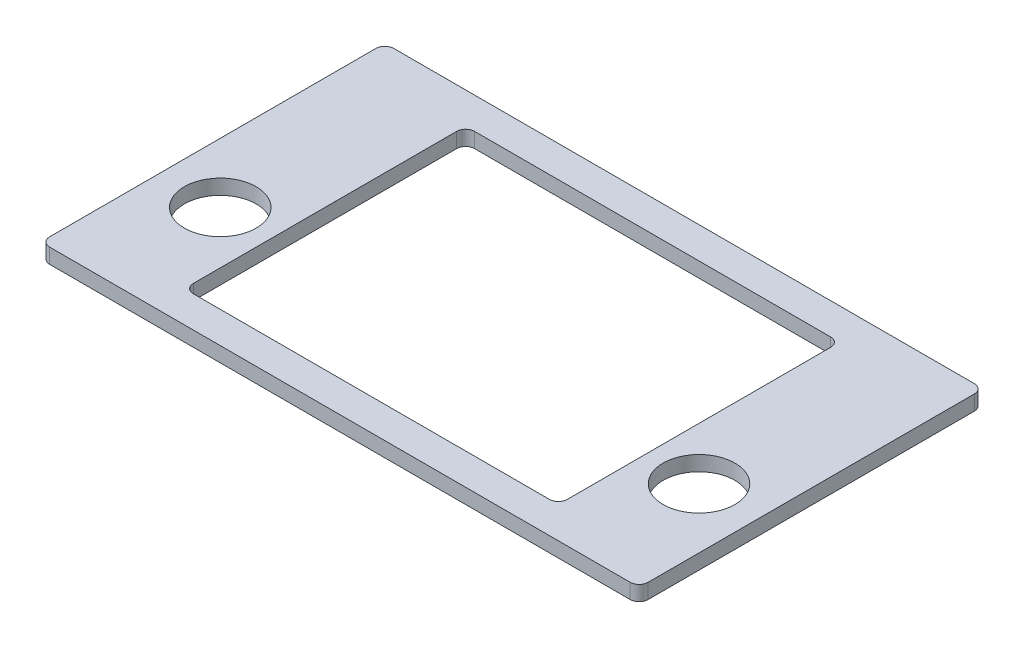
ISO-10303-21;
HEADER;
FILE_DESCRIPTION(('STEP AP214'),'2;1');
FILE_NAME('part.step','',(''),(''),'','','');
FILE_SCHEMA(('AUTOMOTIVE_DESIGN { 1 0 10303 214 1 1 1 1 }'));
ENDSEC;
DATA;
#1=APPLICATION_CONTEXT('core data for automotive mechanical design processes');
#2=APPLICATION_PROTOCOL_DEFINITION('international standard','automotive_design',2000,#1);
#3=PRODUCT_CONTEXT('',#1,'mechanical');
#4=PRODUCT('Part','Part','',(#3));
#5=PRODUCT_RELATED_PRODUCT_CATEGORY('part','',(#4));
#6=PRODUCT_DEFINITION_FORMATION('','',#4);
#7=PRODUCT_DEFINITION_CONTEXT('part definition',#1,'design');
#8=PRODUCT_DEFINITION('design','',#6,#7);
#9=PRODUCT_DEFINITION_SHAPE('','',#8);
#10=(LENGTH_UNIT() NAMED_UNIT(*) SI_UNIT(.MILLI.,.METRE.));
#11=(NAMED_UNIT(*) PLANE_ANGLE_UNIT() SI_UNIT($,.RADIAN.));
#12=(NAMED_UNIT(*) SI_UNIT($,.STERADIAN.) SOLID_ANGLE_UNIT());
#13=UNCERTAINTY_MEASURE_WITH_UNIT(LENGTH_MEASURE(1.E-05),#10,'distance_accuracy_value','');
#14=(GEOMETRIC_REPRESENTATION_CONTEXT(3) GLOBAL_UNCERTAINTY_ASSIGNED_CONTEXT((#13)) GLOBAL_UNIT_ASSIGNED_CONTEXT((#10,
#11,#12)) REPRESENTATION_CONTEXT('',''));
#15=CARTESIAN_POINT('',(0.,0.,0.));
#16=DIRECTION('',(0.,0.,1.));
#17=DIRECTION('',(1.,0.,0.));
#18=AXIS2_PLACEMENT_3D('',#15,#16,#17);
#19=CARTESIAN_POINT('',(250.19,6.35,-3.81));
#20=DIRECTION('',(0.,1.,0.));
#21=DIRECTION('',(0.,0.,1.));
#22=AXIS2_PLACEMENT_3D('',#19,#20,#21);
#23=PLANE('',#22);
#24=CARTESIAN_POINT('',(25.4,6.35,-50.8));
#25=DIRECTION('',(0.,1.,0.));
#26=DIRECTION('',(0.,0.,1.));
#27=AXIS2_PLACEMENT_3D('',#24,#25,#26);
#28=CIRCLE('',#27,15.24);
#29=CARTESIAN_POINT('',(25.4,6.35,-35.56));
#30=VERTEX_POINT('',#29);
#31=EDGE_CURVE('E373',#30,#30,#28,.T.);
#32=ORIENTED_EDGE('',*,*,#31,.F.);
#33=EDGE_LOOP('',(#32));
#34=FACE_BOUND('',#33,.T.);
#35=CARTESIAN_POINT('',(228.6,6.35,-50.8));
#36=DIRECTION('',(0.,1.,0.));
#37=DIRECTION('',(0.,0.,1.));
#38=AXIS2_PLACEMENT_3D('',#35,#36,#37);
#39=CIRCLE('',#38,15.24);
#40=CARTESIAN_POINT('',(228.6,6.35,-35.56));
#41=VERTEX_POINT('',#40);
#42=EDGE_CURVE('E378',#41,#41,#39,.T.);
#43=ORIENTED_EDGE('',*,*,#42,.F.);
#44=EDGE_LOOP('',(#43));
#45=FACE_BOUND('',#44,.T.);
#46=CARTESIAN_POINT('',(250.19,6.35,-3.81));
#47=DIRECTION('',(0.,1.,0.));
#48=DIRECTION('',(0.,0.,1.));
#49=AXIS2_PLACEMENT_3D('',#46,#47,#48);
#50=CIRCLE('',#49,3.80999999999999);
#51=CARTESIAN_POINT('',(250.19,6.35,0.));
#52=VERTEX_POINT('',#51);
#53=CARTESIAN_POINT('',(254.,6.35,-3.81));
#54=VERTEX_POINT('',#53);
#55=EDGE_CURVE('E214',#52,#54,#50,.T.);
#56=ORIENTED_EDGE('',*,*,#55,.T.);
#57=DIRECTION('',(0.,0.,-1.));
#58=VECTOR('',#57,1.);
#59=CARTESIAN_POINT('',(254.,6.35,-3.81));
#60=LINE('',#59,#58);
#61=CARTESIAN_POINT('',(254.,6.35,-142.24));
#62=VERTEX_POINT('',#61);
#63=EDGE_CURVE('E217',#54,#62,#60,.T.);
#64=ORIENTED_EDGE('',*,*,#63,.T.);
#65=CARTESIAN_POINT('',(250.19,6.35,-142.24));
#66=DIRECTION('',(0.,1.,0.));
#67=DIRECTION('',(0.,0.,-1.));
#68=AXIS2_PLACEMENT_3D('',#65,#66,#67);
#69=CIRCLE('',#68,3.81000000000002);
#70=CARTESIAN_POINT('',(250.19,6.35,-146.05));
#71=VERTEX_POINT('',#70);
#72=EDGE_CURVE('E220',#62,#71,#69,.T.);
#73=ORIENTED_EDGE('',*,*,#72,.T.);
#74=DIRECTION('',(-1.,0.,0.));
#75=VECTOR('',#74,1.);
#76=CARTESIAN_POINT('',(3.81,6.35,-146.05));
#77=LINE('',#76,#75);
#78=CARTESIAN_POINT('',(3.81,6.35,-146.05));
#79=VERTEX_POINT('',#78);
#80=EDGE_CURVE('E222',#71,#79,#77,.T.);
#81=ORIENTED_EDGE('',*,*,#80,.T.);
#82=CARTESIAN_POINT('',(3.81,6.35,-142.24));
#83=DIRECTION('',(0.,1.,0.));
#84=DIRECTION('',(0.,0.,-1.));
#85=AXIS2_PLACEMENT_3D('',#82,#83,#84);
#86=CIRCLE('',#85,3.81);
#87=CARTESIAN_POINT('',(0.,6.35,-142.24));
#88=VERTEX_POINT('',#87);
#89=EDGE_CURVE('E224',#79,#88,#86,.T.);
#90=ORIENTED_EDGE('',*,*,#89,.T.);
#91=DIRECTION('',(0.,0.,1.));
#92=VECTOR('',#91,1.);
#93=CARTESIAN_POINT('',(0.,6.35,-3.81000000000003));
#94=LINE('',#93,#92);
#95=CARTESIAN_POINT('',(0.,6.35,-3.81000000000003));
#96=VERTEX_POINT('',#95);
#97=EDGE_CURVE('E226',#88,#96,#94,.T.);
#98=ORIENTED_EDGE('',*,*,#97,.T.);
#99=CARTESIAN_POINT('',(3.81,6.35,-3.81));
#100=DIRECTION('',(0.,1.,0.));
#101=DIRECTION('',(0.,0.,-1.));
#102=AXIS2_PLACEMENT_3D('',#99,#100,#101);
#103=CIRCLE('',#102,3.81);
#104=CARTESIAN_POINT('',(3.81000000000003,6.35,0.));
#105=VERTEX_POINT('',#104);
#106=EDGE_CURVE('E228',#96,#105,#103,.T.);
#107=ORIENTED_EDGE('',*,*,#106,.T.);
#108=DIRECTION('',(1.,0.,0.));
#109=VECTOR('',#108,1.);
#110=CARTESIAN_POINT('',(3.81000000000003,6.35,0.));
#111=LINE('',#110,#109);
#112=EDGE_CURVE('E230',#105,#52,#111,.T.);
#113=ORIENTED_EDGE('',*,*,#112,.T.);
#114=EDGE_LOOP('',(#56,#64,#73,#81,#90,#98,#107,#113));
#115=FACE_BOUND('',#114,.T.);
#116=DIRECTION('',(1.,0.,0.));
#117=VECTOR('',#116,1.);
#118=CARTESIAN_POINT('',(51.435,6.35,-13.335));
#119=LINE('',#118,#117);
#120=CARTESIAN_POINT('',(51.435,6.35,-13.335));
#121=VERTEX_POINT('',#120);
#122=CARTESIAN_POINT('',(202.565,6.35,-13.335));
#123=VERTEX_POINT('',#122);
#124=EDGE_CURVE('E155',#121,#123,#119,.T.);
#125=ORIENTED_EDGE('',*,*,#124,.F.);
#126=CARTESIAN_POINT('',(51.435,6.35,-17.145));
#127=DIRECTION('',(0.,1.,0.));
#128=DIRECTION('',(0.,0.,1.));
#129=AXIS2_PLACEMENT_3D('',#126,#127,#128);
#130=CIRCLE('',#129,3.81);
#131=CARTESIAN_POINT('',(47.625,6.35,-17.145));
#132=VERTEX_POINT('',#131);
#133=EDGE_CURVE('E147',#132,#121,#130,.T.);
#134=ORIENTED_EDGE('',*,*,#133,.F.);
#135=DIRECTION('',(0.,0.,1.));
#136=VECTOR('',#135,1.);
#137=CARTESIAN_POINT('',(47.625,6.35,-128.905));
#138=LINE('',#137,#136);
#139=CARTESIAN_POINT('',(47.625,6.35,-128.905));
#140=VERTEX_POINT('',#139);
#141=EDGE_CURVE('E181',#140,#132,#138,.T.);
#142=ORIENTED_EDGE('',*,*,#141,.F.);
#143=CARTESIAN_POINT('',(51.435,6.35,-128.905));
#144=DIRECTION('',(0.,1.,0.));
#145=DIRECTION('',(0.,0.,1.));
#146=AXIS2_PLACEMENT_3D('',#143,#144,#145);
#147=CIRCLE('',#146,3.81);
#148=CARTESIAN_POINT('',(51.435,6.35,-132.715));
#149=VERTEX_POINT('',#148);
#150=EDGE_CURVE('E179',#149,#140,#147,.T.);
#151=ORIENTED_EDGE('',*,*,#150,.F.);
#152=DIRECTION('',(-1.,0.,0.));
#153=VECTOR('',#152,1.);
#154=CARTESIAN_POINT('',(51.435,6.35,-132.715));
#155=LINE('',#154,#153);
#156=CARTESIAN_POINT('',(202.565,6.35,-132.715));
#157=VERTEX_POINT('',#156);
#158=EDGE_CURVE('E177',#157,#149,#155,.T.);
#159=ORIENTED_EDGE('',*,*,#158,.F.);
#160=CARTESIAN_POINT('',(202.565,6.35,-128.905));
#161=DIRECTION('',(0.,1.,0.));
#162=DIRECTION('',(0.,0.,-1.));
#163=AXIS2_PLACEMENT_3D('',#160,#161,#162);
#164=CIRCLE('',#163,3.81000000000001);
#165=CARTESIAN_POINT('',(206.375,6.35,-128.905));
#166=VERTEX_POINT('',#165);
#167=EDGE_CURVE('E175',#166,#157,#164,.T.);
#168=ORIENTED_EDGE('',*,*,#167,.F.);
#169=DIRECTION('',(0.,0.,-1.));
#170=VECTOR('',#169,1.);
#171=CARTESIAN_POINT('',(206.375,6.35,-128.905));
#172=LINE('',#171,#170);
#173=CARTESIAN_POINT('',(206.375,6.35,-17.145));
#174=VERTEX_POINT('',#173);
#175=EDGE_CURVE('E170',#174,#166,#172,.T.);
#176=ORIENTED_EDGE('',*,*,#175,.F.);
#177=CARTESIAN_POINT('',(202.565,6.35,-17.145));
#178=DIRECTION('',(0.,1.,0.));
#179=DIRECTION('',(0.,0.,1.));
#180=AXIS2_PLACEMENT_3D('',#177,#178,#179);
#181=CIRCLE('',#180,3.80999999999998);
#182=EDGE_CURVE('E168',#123,#174,#181,.T.);
#183=ORIENTED_EDGE('',*,*,#182,.F.);
#184=EDGE_LOOP('',(#125,#134,#142,#151,#159,#168,#176,#183));
#185=FACE_BOUND('',#184,.T.);
#186=ADVANCED_FACE('F34',(#34,#45,#115,#185),#23,.T.);
#187=CARTESIAN_POINT('',(250.19,0.,-3.81));
#188=DIRECTION('',(0.,1.,0.));
#189=DIRECTION('',(0.,0.,1.));
#190=AXIS2_PLACEMENT_3D('',#187,#188,#189);
#191=PLANE('',#190);
#192=CARTESIAN_POINT('',(25.4,0.,-50.8));
#193=DIRECTION('',(0.,1.,0.));
#194=DIRECTION('',(0.,0.,1.));
#195=AXIS2_PLACEMENT_3D('',#192,#193,#194);
#196=CIRCLE('',#195,15.24);
#197=CARTESIAN_POINT('',(25.4,0.,-35.56));
#198=VERTEX_POINT('',#197);
#199=EDGE_CURVE('E184',#198,#198,#196,.T.);
#200=ORIENTED_EDGE('',*,*,#199,.T.);
#201=EDGE_LOOP('',(#200));
#202=FACE_BOUND('',#201,.T.);
#203=CARTESIAN_POINT('',(228.6,0.,-50.8));
#204=DIRECTION('',(0.,1.,0.));
#205=DIRECTION('',(0.,0.,1.));
#206=AXIS2_PLACEMENT_3D('',#203,#204,#205);
#207=CIRCLE('',#206,15.24);
#208=CARTESIAN_POINT('',(228.6,0.,-35.56));
#209=VERTEX_POINT('',#208);
#210=EDGE_CURVE('E374',#209,#209,#207,.T.);
#211=ORIENTED_EDGE('',*,*,#210,.T.);
#212=EDGE_LOOP('',(#211));
#213=FACE_BOUND('',#212,.T.);
#214=CARTESIAN_POINT('',(250.19,0.,-3.81));
#215=DIRECTION('',(0.,1.,0.));
#216=DIRECTION('',(0.,0.,1.));
#217=AXIS2_PLACEMENT_3D('',#214,#215,#216);
#218=CIRCLE('',#217,3.80999999999999);
#219=CARTESIAN_POINT('',(250.19,0.,0.));
#220=VERTEX_POINT('',#219);
#221=CARTESIAN_POINT('',(254.,0.,-3.81));
#222=VERTEX_POINT('',#221);
#223=EDGE_CURVE('E163',#220,#222,#218,.T.);
#224=ORIENTED_EDGE('',*,*,#223,.F.);
#225=DIRECTION('',(1.,0.,0.));
#226=VECTOR('',#225,1.);
#227=CARTESIAN_POINT('',(3.81000000000003,0.,0.));
#228=LINE('',#227,#226);
#229=CARTESIAN_POINT('',(3.81000000000003,0.,0.));
#230=VERTEX_POINT('',#229);
#231=EDGE_CURVE('E218',#230,#220,#228,.T.);
#232=ORIENTED_EDGE('',*,*,#231,.F.);
#233=CARTESIAN_POINT('',(3.81,0.,-3.81));
#234=DIRECTION('',(0.,1.,0.));
#235=DIRECTION('',(0.,0.,-1.));
#236=AXIS2_PLACEMENT_3D('',#233,#234,#235);
#237=CIRCLE('',#236,3.81);
#238=CARTESIAN_POINT('',(0.,0.,-3.81000000000003));
#239=VERTEX_POINT('',#238);
#240=EDGE_CURVE('E245',#239,#230,#237,.T.);
#241=ORIENTED_EDGE('',*,*,#240,.F.);
#242=DIRECTION('',(0.,0.,1.));
#243=VECTOR('',#242,1.);
#244=CARTESIAN_POINT('',(0.,0.,-3.81000000000003));
#245=LINE('',#244,#243);
#246=CARTESIAN_POINT('',(0.,0.,-142.24));
#247=VERTEX_POINT('',#246);
#248=EDGE_CURVE('E243',#247,#239,#245,.T.);
#249=ORIENTED_EDGE('',*,*,#248,.F.);
#250=CARTESIAN_POINT('',(3.81,0.,-142.24));
#251=DIRECTION('',(0.,1.,0.));
#252=DIRECTION('',(0.,0.,-1.));
#253=AXIS2_PLACEMENT_3D('',#250,#251,#252);
#254=CIRCLE('',#253,3.81);
#255=CARTESIAN_POINT('',(3.81,0.,-146.05));
#256=VERTEX_POINT('',#255);
#257=EDGE_CURVE('E241',#256,#247,#254,.T.);
#258=ORIENTED_EDGE('',*,*,#257,.F.);
#259=DIRECTION('',(-1.,0.,0.));
#260=VECTOR('',#259,1.);
#261=CARTESIAN_POINT('',(3.81,0.,-146.05));
#262=LINE('',#261,#260);
#263=CARTESIAN_POINT('',(250.19,0.,-146.05));
#264=VERTEX_POINT('',#263);
#265=EDGE_CURVE('E239',#264,#256,#262,.T.);
#266=ORIENTED_EDGE('',*,*,#265,.F.);
#267=CARTESIAN_POINT('',(250.19,0.,-142.24));
#268=DIRECTION('',(0.,1.,0.));
#269=DIRECTION('',(0.,0.,-1.));
#270=AXIS2_PLACEMENT_3D('',#267,#268,#269);
#271=CIRCLE('',#270,3.81000000000002);
#272=CARTESIAN_POINT('',(254.,0.,-142.24));
#273=VERTEX_POINT('',#272);
#274=EDGE_CURVE('E237',#273,#264,#271,.T.);
#275=ORIENTED_EDGE('',*,*,#274,.F.);
#276=DIRECTION('',(0.,0.,-1.));
#277=VECTOR('',#276,1.);
#278=CARTESIAN_POINT('',(254.,0.,-3.81));
#279=LINE('',#278,#277);
#280=EDGE_CURVE('E235',#222,#273,#279,.T.);
#281=ORIENTED_EDGE('',*,*,#280,.F.);
#282=EDGE_LOOP('',(#224,#232,#241,#249,#258,#266,#275,#281));
#283=FACE_BOUND('',#282,.T.);
#284=CARTESIAN_POINT('',(51.435,0.,-17.145));
#285=DIRECTION('',(0.,1.,0.));
#286=DIRECTION('',(0.,0.,1.));
#287=AXIS2_PLACEMENT_3D('',#284,#285,#286);
#288=CIRCLE('',#287,3.81);
#289=CARTESIAN_POINT('',(47.6250000000001,0.,-17.145));
#290=VERTEX_POINT('',#289);
#291=CARTESIAN_POINT('',(51.435,0.,-13.335));
#292=VERTEX_POINT('',#291);
#293=EDGE_CURVE('E57',#290,#292,#288,.T.);
#294=ORIENTED_EDGE('',*,*,#293,.T.);
#295=DIRECTION('',(1.,0.,0.));
#296=VECTOR('',#295,1.);
#297=CARTESIAN_POINT('',(51.435,0.,-13.335));
#298=LINE('',#297,#296);
#299=CARTESIAN_POINT('',(202.565,0.,-13.335));
#300=VERTEX_POINT('',#299);
#301=EDGE_CURVE('E162',#292,#300,#298,.T.);
#302=ORIENTED_EDGE('',*,*,#301,.T.);
#303=CARTESIAN_POINT('',(202.565,0.,-17.145));
#304=DIRECTION('',(0.,1.,0.));
#305=DIRECTION('',(0.,0.,1.));
#306=AXIS2_PLACEMENT_3D('',#303,#304,#305);
#307=CIRCLE('',#306,3.80999999999998);
#308=CARTESIAN_POINT('',(206.375,0.,-17.145));
#309=VERTEX_POINT('',#308);
#310=EDGE_CURVE('E186',#300,#309,#307,.T.);
#311=ORIENTED_EDGE('',*,*,#310,.T.);
#312=DIRECTION('',(0.,0.,-1.));
#313=VECTOR('',#312,1.);
#314=CARTESIAN_POINT('',(206.375,0.,-128.905));
#315=LINE('',#314,#313);
#316=CARTESIAN_POINT('',(206.375,0.,-128.905));
#317=VERTEX_POINT('',#316);
#318=EDGE_CURVE('E189',#309,#317,#315,.T.);
#319=ORIENTED_EDGE('',*,*,#318,.T.);
#320=CARTESIAN_POINT('',(202.565,0.,-128.905));
#321=DIRECTION('',(0.,1.,0.));
#322=DIRECTION('',(0.,0.,-1.));
#323=AXIS2_PLACEMENT_3D('',#320,#321,#322);
#324=CIRCLE('',#323,3.81000000000001);
#325=CARTESIAN_POINT('',(202.565,0.,-132.715));
#326=VERTEX_POINT('',#325);
#327=EDGE_CURVE('E192',#317,#326,#324,.T.);
#328=ORIENTED_EDGE('',*,*,#327,.T.);
#329=DIRECTION('',(-1.,0.,0.));
#330=VECTOR('',#329,1.);
#331=CARTESIAN_POINT('',(51.435,0.,-132.715));
#332=LINE('',#331,#330);
#333=CARTESIAN_POINT('',(51.435,0.,-132.715));
#334=VERTEX_POINT('',#333);
#335=EDGE_CURVE('E195',#326,#334,#332,.T.);
#336=ORIENTED_EDGE('',*,*,#335,.T.);
#337=CARTESIAN_POINT('',(51.435,0.,-128.905));
#338=DIRECTION('',(0.,1.,0.));
#339=DIRECTION('',(0.,0.,1.));
#340=AXIS2_PLACEMENT_3D('',#337,#338,#339);
#341=CIRCLE('',#340,3.81);
#342=CARTESIAN_POINT('',(47.625,0.,-128.905));
#343=VERTEX_POINT('',#342);
#344=EDGE_CURVE('E198',#334,#343,#341,.T.);
#345=ORIENTED_EDGE('',*,*,#344,.T.);
#346=DIRECTION('',(0.,0.,1.));
#347=VECTOR('',#346,1.);
#348=CARTESIAN_POINT('',(47.625,0.,-128.905));
#349=LINE('',#348,#347);
#350=EDGE_CURVE('E156',#343,#290,#349,.T.);
#351=ORIENTED_EDGE('',*,*,#350,.T.);
#352=EDGE_LOOP('',(#294,#302,#311,#319,#328,#336,#345,#351));
#353=FACE_BOUND('',#352,.T.);
#354=ADVANCED_FACE('F275',(#202,#213,#283,#353),#191,.F.);
#355=CARTESIAN_POINT('',(250.19,6.35,-3.81));
#356=DIRECTION('',(0.,-1.,0.));
#357=DIRECTION('',(0.,0.,-1.));
#358=AXIS2_PLACEMENT_3D('',#355,#356,#357);
#359=CYLINDRICAL_SURFACE('',#358,3.80999999999999);
#360=ORIENTED_EDGE('',*,*,#223,.T.);
#361=DIRECTION('',(0.,-1.,0.));
#362=VECTOR('',#361,1.);
#363=CARTESIAN_POINT('',(254.,6.35,-3.81));
#364=LINE('',#363,#362);
#365=EDGE_CURVE('E11',#54,#222,#364,.T.);
#366=ORIENTED_EDGE('',*,*,#365,.F.);
#367=ORIENTED_EDGE('',*,*,#55,.F.);
#368=DIRECTION('',(0.,-1.,0.));
#369=VECTOR('',#368,1.);
#370=CARTESIAN_POINT('',(250.19,6.35,0.));
#371=LINE('',#370,#369);
#372=EDGE_CURVE('E232',#52,#220,#371,.T.);
#373=ORIENTED_EDGE('',*,*,#372,.T.);
#374=EDGE_LOOP('',(#360,#366,#367,#373));
#375=FACE_BOUND('',#374,.T.);
#376=ADVANCED_FACE('F36',(#375),#359,.T.);
#377=CARTESIAN_POINT('',(254.,6.35,-3.81));
#378=DIRECTION('',(-1.,0.,0.));
#379=DIRECTION('',(0.,0.,1.));
#380=AXIS2_PLACEMENT_3D('',#377,#378,#379);
#381=PLANE('',#380);
#382=ORIENTED_EDGE('',*,*,#280,.T.);
#383=DIRECTION('',(0.,-1.,0.));
#384=VECTOR('',#383,1.);
#385=CARTESIAN_POINT('',(254.,6.35,-142.24));
#386=LINE('',#385,#384);
#387=EDGE_CURVE('E42',#62,#273,#386,.T.);
#388=ORIENTED_EDGE('',*,*,#387,.F.);
#389=ORIENTED_EDGE('',*,*,#63,.F.);
#390=ORIENTED_EDGE('',*,*,#365,.T.);
#391=EDGE_LOOP('',(#382,#388,#389,#390));
#392=FACE_BOUND('',#391,.T.);
#393=ADVANCED_FACE('F292',(#392),#381,.F.);
#394=CARTESIAN_POINT('',(250.19,6.35,-142.24));
#395=DIRECTION('',(0.,-1.,0.));
#396=DIRECTION('',(0.,0.,-1.));
#397=AXIS2_PLACEMENT_3D('',#394,#395,#396);
#398=CYLINDRICAL_SURFACE('',#397,3.81000000000002);
#399=ORIENTED_EDGE('',*,*,#274,.T.);
#400=DIRECTION('',(0.,-1.,0.));
#401=VECTOR('',#400,1.);
#402=CARTESIAN_POINT('',(250.19,6.35,-146.05));
#403=LINE('',#402,#401);
#404=EDGE_CURVE('E262',#71,#264,#403,.T.);
#405=ORIENTED_EDGE('',*,*,#404,.F.);
#406=ORIENTED_EDGE('',*,*,#72,.F.);
#407=ORIENTED_EDGE('',*,*,#387,.T.);
#408=EDGE_LOOP('',(#399,#405,#406,#407));
#409=FACE_BOUND('',#408,.T.);
#410=ADVANCED_FACE('F269',(#409),#398,.T.);
#411=CARTESIAN_POINT('',(3.81,6.35,-146.05));
#412=DIRECTION('',(0.,0.,1.));
#413=DIRECTION('',(1.,0.,0.));
#414=AXIS2_PLACEMENT_3D('',#411,#412,#413);
#415=PLANE('',#414);
#416=ORIENTED_EDGE('',*,*,#265,.T.);
#417=DIRECTION('',(0.,-1.,0.));
#418=VECTOR('',#417,1.);
#419=CARTESIAN_POINT('',(3.81,6.35,-146.05));
#420=LINE('',#419,#418);
#421=EDGE_CURVE('E259',#79,#256,#420,.T.);
#422=ORIENTED_EDGE('',*,*,#421,.F.);
#423=ORIENTED_EDGE('',*,*,#80,.F.);
#424=ORIENTED_EDGE('',*,*,#404,.T.);
#425=EDGE_LOOP('',(#416,#422,#423,#424));
#426=FACE_BOUND('',#425,.T.);
#427=ADVANCED_FACE('F281',(#426),#415,.F.);
#428=CARTESIAN_POINT('',(3.81,6.35,-142.24));
#429=DIRECTION('',(0.,-1.,0.));
#430=DIRECTION('',(0.,0.,-1.));
#431=AXIS2_PLACEMENT_3D('',#428,#429,#430);
#432=CYLINDRICAL_SURFACE('',#431,3.81);
#433=ORIENTED_EDGE('',*,*,#257,.T.);
#434=DIRECTION('',(0.,-1.,0.));
#435=VECTOR('',#434,1.);
#436=CARTESIAN_POINT('',(0.,6.35,-142.24));
#437=LINE('',#436,#435);
#438=EDGE_CURVE('E256',#88,#247,#437,.T.);
#439=ORIENTED_EDGE('',*,*,#438,.F.);
#440=ORIENTED_EDGE('',*,*,#89,.F.);
#441=ORIENTED_EDGE('',*,*,#421,.T.);
#442=EDGE_LOOP('',(#433,#439,#440,#441));
#443=FACE_BOUND('',#442,.T.);
#444=ADVANCED_FACE('F285',(#443),#432,.T.);
#445=CARTESIAN_POINT('',(0.,6.35,-3.81000000000003));
#446=DIRECTION('',(1.,0.,0.));
#447=DIRECTION('',(0.,0.,-1.));
#448=AXIS2_PLACEMENT_3D('',#445,#446,#447);
#449=PLANE('',#448);
#450=ORIENTED_EDGE('',*,*,#248,.T.);
#451=DIRECTION('',(0.,-1.,0.));
#452=VECTOR('',#451,1.);
#453=CARTESIAN_POINT('',(0.,6.35,-3.81000000000003));
#454=LINE('',#453,#452);
#455=EDGE_CURVE('E253',#96,#239,#454,.T.);
#456=ORIENTED_EDGE('',*,*,#455,.F.);
#457=ORIENTED_EDGE('',*,*,#97,.F.);
#458=ORIENTED_EDGE('',*,*,#438,.T.);
#459=EDGE_LOOP('',(#450,#456,#457,#458));
#460=FACE_BOUND('',#459,.T.);
#461=ADVANCED_FACE('F305',(#460),#449,.F.);
#462=CARTESIAN_POINT('',(3.81,6.35,-3.81));
#463=DIRECTION('',(0.,-1.,0.));
#464=DIRECTION('',(0.,0.,-1.));
#465=AXIS2_PLACEMENT_3D('',#462,#463,#464);
#466=CYLINDRICAL_SURFACE('',#465,3.81);
#467=ORIENTED_EDGE('',*,*,#240,.T.);
#468=DIRECTION('',(0.,-1.,0.));
#469=VECTOR('',#468,1.);
#470=CARTESIAN_POINT('',(3.81000000000003,6.35,0.));
#471=LINE('',#470,#469);
#472=EDGE_CURVE('E250',#105,#230,#471,.T.);
#473=ORIENTED_EDGE('',*,*,#472,.F.);
#474=ORIENTED_EDGE('',*,*,#106,.F.);
#475=ORIENTED_EDGE('',*,*,#455,.T.);
#476=EDGE_LOOP('',(#467,#473,#474,#475));
#477=FACE_BOUND('',#476,.T.);
#478=ADVANCED_FACE('F303',(#477),#466,.T.);
#479=CARTESIAN_POINT('',(3.81000000000003,6.35,0.));
#480=DIRECTION('',(0.,0.,-1.));
#481=DIRECTION('',(-1.,0.,0.));
#482=AXIS2_PLACEMENT_3D('',#479,#480,#481);
#483=PLANE('',#482);
#484=ORIENTED_EDGE('',*,*,#231,.T.);
#485=ORIENTED_EDGE('',*,*,#372,.F.);
#486=ORIENTED_EDGE('',*,*,#112,.F.);
#487=ORIENTED_EDGE('',*,*,#472,.T.);
#488=EDGE_LOOP('',(#484,#485,#486,#487));
#489=FACE_BOUND('',#488,.T.);
#490=ADVANCED_FACE('F298',(#489),#483,.F.);
#491=CARTESIAN_POINT('',(51.435,6.35,-17.145));
#492=DIRECTION('',(0.,-1.,0.));
#493=DIRECTION('',(0.,0.,-1.));
#494=AXIS2_PLACEMENT_3D('',#491,#492,#493);
#495=CYLINDRICAL_SURFACE('',#494,3.81);
#496=ORIENTED_EDGE('',*,*,#293,.F.);
#497=DIRECTION('',(0.,-1.,0.));
#498=VECTOR('',#497,1.);
#499=CARTESIAN_POINT('',(47.625,6.35,-17.145));
#500=LINE('',#499,#498);
#501=EDGE_CURVE('E151',#132,#290,#500,.T.);
#502=ORIENTED_EDGE('',*,*,#501,.F.);
#503=ORIENTED_EDGE('',*,*,#133,.T.);
#504=DIRECTION('',(0.,-1.,0.));
#505=VECTOR('',#504,1.);
#506=CARTESIAN_POINT('',(51.435,6.35,-13.335));
#507=LINE('',#506,#505);
#508=EDGE_CURVE('E150',#121,#292,#507,.T.);
#509=ORIENTED_EDGE('',*,*,#508,.T.);
#510=EDGE_LOOP('',(#496,#502,#503,#509));
#511=FACE_BOUND('',#510,.T.);
#512=ADVANCED_FACE('F149',(#511),#495,.F.);
#513=CARTESIAN_POINT('',(51.435,6.35,-13.335));
#514=DIRECTION('',(0.,0.,-1.));
#515=DIRECTION('',(-1.,0.,0.));
#516=AXIS2_PLACEMENT_3D('',#513,#514,#515);
#517=PLANE('',#516);
#518=ORIENTED_EDGE('',*,*,#301,.F.);
#519=ORIENTED_EDGE('',*,*,#508,.F.);
#520=ORIENTED_EDGE('',*,*,#124,.T.);
#521=DIRECTION('',(0.,-1.,0.));
#522=VECTOR('',#521,1.);
#523=CARTESIAN_POINT('',(202.565,6.35,-13.335));
#524=LINE('',#523,#522);
#525=EDGE_CURVE('E164',#123,#300,#524,.T.);
#526=ORIENTED_EDGE('',*,*,#525,.T.);
#527=EDGE_LOOP('',(#518,#519,#520,#526));
#528=FACE_BOUND('',#527,.T.);
#529=ADVANCED_FACE('F159',(#528),#517,.T.);
#530=CARTESIAN_POINT('',(202.565,6.35,-17.145));
#531=DIRECTION('',(0.,-1.,0.));
#532=DIRECTION('',(0.,0.,-1.));
#533=AXIS2_PLACEMENT_3D('',#530,#531,#532);
#534=CYLINDRICAL_SURFACE('',#533,3.80999999999998);
#535=ORIENTED_EDGE('',*,*,#310,.F.);
#536=ORIENTED_EDGE('',*,*,#525,.F.);
#537=ORIENTED_EDGE('',*,*,#182,.T.);
#538=DIRECTION('',(0.,-1.,0.));
#539=VECTOR('',#538,1.);
#540=CARTESIAN_POINT('',(206.375,6.35,-17.145));
#541=LINE('',#540,#539);
#542=EDGE_CURVE('E211',#174,#309,#541,.T.);
#543=ORIENTED_EDGE('',*,*,#542,.T.);
#544=EDGE_LOOP('',(#535,#536,#537,#543));
#545=FACE_BOUND('',#544,.T.);
#546=ADVANCED_FACE('F334',(#545),#534,.F.);
#547=CARTESIAN_POINT('',(206.375,6.35,-128.905));
#548=DIRECTION('',(-1.,0.,0.));
#549=DIRECTION('',(0.,0.,1.));
#550=AXIS2_PLACEMENT_3D('',#547,#548,#549);
#551=PLANE('',#550);
#552=ORIENTED_EDGE('',*,*,#318,.F.);
#553=ORIENTED_EDGE('',*,*,#542,.F.);
#554=ORIENTED_EDGE('',*,*,#175,.T.);
#555=DIRECTION('',(0.,-1.,0.));
#556=VECTOR('',#555,1.);
#557=CARTESIAN_POINT('',(206.375,6.35,-128.905));
#558=LINE('',#557,#556);
#559=EDGE_CURVE('E209',#166,#317,#558,.T.);
#560=ORIENTED_EDGE('',*,*,#559,.T.);
#561=EDGE_LOOP('',(#552,#553,#554,#560));
#562=FACE_BOUND('',#561,.T.);
#563=ADVANCED_FACE('F338',(#562),#551,.T.);
#564=CARTESIAN_POINT('',(202.565,6.35,-128.905));
#565=DIRECTION('',(0.,-1.,0.));
#566=DIRECTION('',(0.,0.,-1.));
#567=AXIS2_PLACEMENT_3D('',#564,#565,#566);
#568=CYLINDRICAL_SURFACE('',#567,3.81000000000001);
#569=ORIENTED_EDGE('',*,*,#327,.F.);
#570=ORIENTED_EDGE('',*,*,#559,.F.);
#571=ORIENTED_EDGE('',*,*,#167,.T.);
#572=DIRECTION('',(0.,-1.,0.));
#573=VECTOR('',#572,1.);
#574=CARTESIAN_POINT('',(202.565,6.35,-132.715));
#575=LINE('',#574,#573);
#576=EDGE_CURVE('E207',#157,#326,#575,.T.);
#577=ORIENTED_EDGE('',*,*,#576,.T.);
#578=EDGE_LOOP('',(#569,#570,#571,#577));
#579=FACE_BOUND('',#578,.T.);
#580=ADVANCED_FACE('F344',(#579),#568,.F.);
#581=CARTESIAN_POINT('',(51.435,6.35,-132.715));
#582=DIRECTION('',(0.,0.,1.));
#583=DIRECTION('',(1.,0.,0.));
#584=AXIS2_PLACEMENT_3D('',#581,#582,#583);
#585=PLANE('',#584);
#586=ORIENTED_EDGE('',*,*,#335,.F.);
#587=ORIENTED_EDGE('',*,*,#576,.F.);
#588=ORIENTED_EDGE('',*,*,#158,.T.);
#589=DIRECTION('',(0.,-1.,0.));
#590=VECTOR('',#589,1.);
#591=CARTESIAN_POINT('',(51.435,6.35,-132.715));
#592=LINE('',#591,#590);
#593=EDGE_CURVE('E205',#149,#334,#592,.T.);
#594=ORIENTED_EDGE('',*,*,#593,.T.);
#595=EDGE_LOOP('',(#586,#587,#588,#594));
#596=FACE_BOUND('',#595,.T.);
#597=ADVANCED_FACE('F348',(#596),#585,.T.);
#598=CARTESIAN_POINT('',(51.435,6.35,-128.905));
#599=DIRECTION('',(0.,-1.,0.));
#600=DIRECTION('',(0.,0.,-1.));
#601=AXIS2_PLACEMENT_3D('',#598,#599,#600);
#602=CYLINDRICAL_SURFACE('',#601,3.81);
#603=ORIENTED_EDGE('',*,*,#344,.F.);
#604=ORIENTED_EDGE('',*,*,#593,.F.);
#605=ORIENTED_EDGE('',*,*,#150,.T.);
#606=DIRECTION('',(0.,-1.,0.));
#607=VECTOR('',#606,1.);
#608=CARTESIAN_POINT('',(47.625,6.35,-128.905));
#609=LINE('',#608,#607);
#610=EDGE_CURVE('E49',#140,#343,#609,.T.);
#611=ORIENTED_EDGE('',*,*,#610,.T.);
#612=EDGE_LOOP('',(#603,#604,#605,#611));
#613=FACE_BOUND('',#612,.T.);
#614=ADVANCED_FACE('F352',(#613),#602,.F.);
#615=CARTESIAN_POINT('',(47.625,6.35,-128.905));
#616=DIRECTION('',(1.,0.,0.));
#617=DIRECTION('',(0.,0.,-1.));
#618=AXIS2_PLACEMENT_3D('',#615,#616,#617);
#619=PLANE('',#618);
#620=ORIENTED_EDGE('',*,*,#350,.F.);
#621=ORIENTED_EDGE('',*,*,#610,.F.);
#622=ORIENTED_EDGE('',*,*,#141,.T.);
#623=ORIENTED_EDGE('',*,*,#501,.T.);
#624=EDGE_LOOP('',(#620,#621,#622,#623));
#625=FACE_BOUND('',#624,.T.);
#626=ADVANCED_FACE('F356',(#625),#619,.T.);
#627=CARTESIAN_POINT('',(228.6,0.,-50.8));
#628=DIRECTION('',(0.,1.,0.));
#629=DIRECTION('',(0.,0.,1.));
#630=AXIS2_PLACEMENT_3D('',#627,#628,#629);
#631=CYLINDRICAL_SURFACE('',#630,15.24);
#632=ORIENTED_EDGE('',*,*,#210,.F.);
#633=EDGE_LOOP('',(#632));
#634=FACE_BOUND('',#633,.T.);
#635=ORIENTED_EDGE('',*,*,#42,.T.);
#636=EDGE_LOOP('',(#635));
#637=FACE_BOUND('',#636,.T.);
#638=ADVANCED_FACE('F360',(#634,#637),#631,.F.);
#639=CARTESIAN_POINT('',(25.4,0.,-50.8));
#640=DIRECTION('',(0.,1.,0.));
#641=DIRECTION('',(0.,0.,1.));
#642=AXIS2_PLACEMENT_3D('',#639,#640,#641);
#643=CYLINDRICAL_SURFACE('',#642,15.24);
#644=ORIENTED_EDGE('',*,*,#199,.F.);
#645=EDGE_LOOP('',(#644));
#646=FACE_BOUND('',#645,.T.);
#647=ORIENTED_EDGE('',*,*,#31,.T.);
#648=EDGE_LOOP('',(#647));
#649=FACE_BOUND('',#648,.T.);
#650=ADVANCED_FACE('F363',(#646,#649),#643,.F.);
#651=CLOSED_SHELL('',(#186,#354,#376,#393,#410,#427,#444,#461,#478,#490,#512,#529,#546,#563,
#580,#597,#614,#626,#638,#650));
#652=MANIFOLD_SOLID_BREP('B2',#651);
#653=ADVANCED_BREP_SHAPE_REPRESENTATION('',(#18,#652),#14);
#654=SHAPE_DEFINITION_REPRESENTATION(#9,#653);
ENDSEC;
END-ISO-10303-21;
